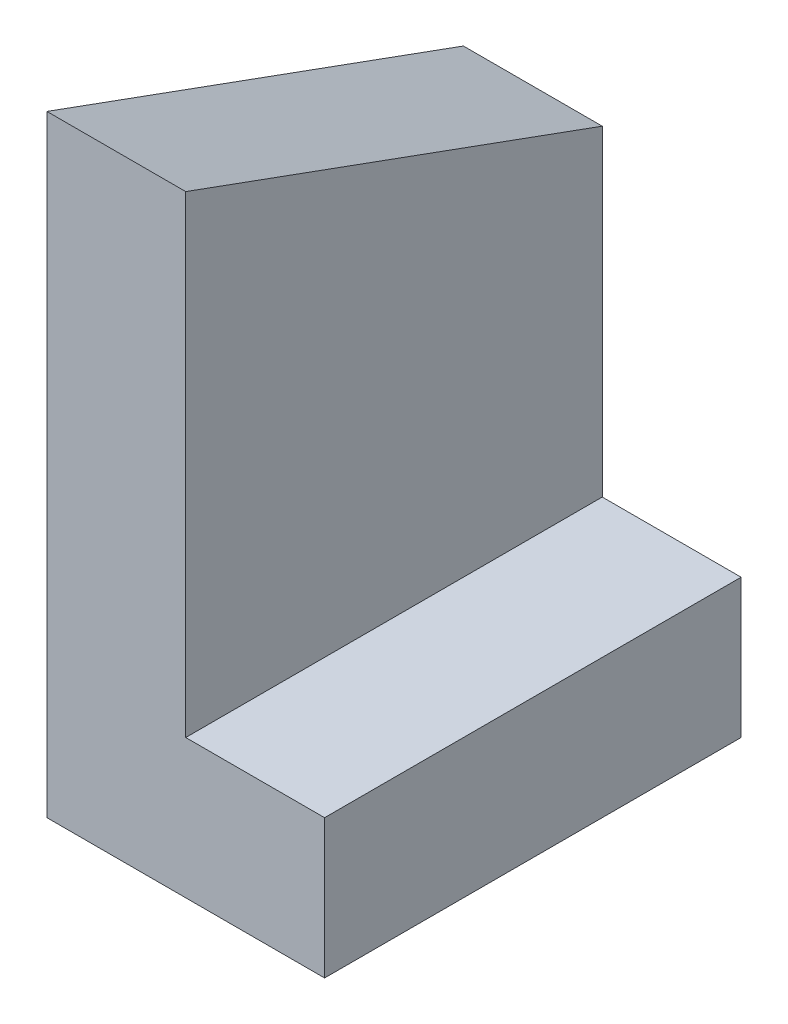
ISO-10303-21;
HEADER;
FILE_DESCRIPTION(('STEP AP214'),'2;1');
FILE_NAME('part.step','',(''),(''),'','','');
FILE_SCHEMA(('AUTOMOTIVE_DESIGN { 1 0 10303 214 1 1 1 1 }'));
ENDSEC;
DATA;
#1=APPLICATION_CONTEXT('core data for automotive mechanical design processes');
#2=APPLICATION_PROTOCOL_DEFINITION('international standard','automotive_design',2000,#1);
#3=PRODUCT_CONTEXT('',#1,'mechanical');
#4=PRODUCT('Part','Part','',(#3));
#5=PRODUCT_RELATED_PRODUCT_CATEGORY('part','',(#4));
#6=PRODUCT_DEFINITION_FORMATION('','',#4);
#7=PRODUCT_DEFINITION_CONTEXT('part definition',#1,'design');
#8=PRODUCT_DEFINITION('design','',#6,#7);
#9=PRODUCT_DEFINITION_SHAPE('','',#8);
#10=(LENGTH_UNIT() NAMED_UNIT(*) SI_UNIT(.MILLI.,.METRE.));
#11=(NAMED_UNIT(*) PLANE_ANGLE_UNIT() SI_UNIT($,.RADIAN.));
#12=(NAMED_UNIT(*) SI_UNIT($,.STERADIAN.) SOLID_ANGLE_UNIT());
#13=UNCERTAINTY_MEASURE_WITH_UNIT(LENGTH_MEASURE(1.E-05),#10,'distance_accuracy_value','');
#14=(GEOMETRIC_REPRESENTATION_CONTEXT(3) GLOBAL_UNCERTAINTY_ASSIGNED_CONTEXT((#13)) GLOBAL_UNIT_ASSIGNED_CONTEXT((#10,
#11,#12)) REPRESENTATION_CONTEXT('',''));
#15=CARTESIAN_POINT('',(0.,0.,0.));
#16=DIRECTION('',(0.,0.,1.));
#17=DIRECTION('',(1.,0.,0.));
#18=AXIS2_PLACEMENT_3D('',#15,#16,#17);
#19=CARTESIAN_POINT('',(0.,0.,15.));
#20=DIRECTION('',(0.,1.,0.));
#21=DIRECTION('',(0.,0.,1.));
#22=AXIS2_PLACEMENT_3D('',#19,#20,#21);
#23=PLANE('',#22);
#24=DIRECTION('',(1.,0.,0.));
#25=VECTOR('',#24,1.);
#26=CARTESIAN_POINT('',(0.,0.,0.));
#27=LINE('',#26,#25);
#28=CARTESIAN_POINT('',(0.,0.,0.));
#29=VERTEX_POINT('',#28);
#30=CARTESIAN_POINT('',(10.,0.,0.));
#31=VERTEX_POINT('',#30);
#32=EDGE_CURVE('E116',#29,#31,#27,.T.);
#33=ORIENTED_EDGE('',*,*,#32,.T.);
#34=DIRECTION('',(0.,0.,-1.));
#35=VECTOR('',#34,1.);
#36=CARTESIAN_POINT('',(10.,0.,15.));
#37=LINE('',#36,#35);
#38=CARTESIAN_POINT('',(10.,0.,15.));
#39=VERTEX_POINT('',#38);
#40=EDGE_CURVE('E40',#39,#31,#37,.T.);
#41=ORIENTED_EDGE('',*,*,#40,.F.);
#42=DIRECTION('',(1.,0.,0.));
#43=VECTOR('',#42,1.);
#44=CARTESIAN_POINT('',(0.,0.,15.));
#45=LINE('',#44,#43);
#46=CARTESIAN_POINT('',(0.,0.,15.));
#47=VERTEX_POINT('',#46);
#48=EDGE_CURVE('E125',#47,#39,#45,.T.);
#49=ORIENTED_EDGE('',*,*,#48,.F.);
#50=DIRECTION('',(0.,0.,-1.));
#51=VECTOR('',#50,1.);
#52=CARTESIAN_POINT('',(0.,0.,15.));
#53=LINE('',#52,#51);
#54=EDGE_CURVE('E111',#47,#29,#53,.T.);
#55=ORIENTED_EDGE('',*,*,#54,.T.);
#56=EDGE_LOOP('',(#33,#41,#49,#55));
#57=FACE_BOUND('',#56,.T.);
#58=ADVANCED_FACE('F33',(#57),#23,.F.);
#59=CARTESIAN_POINT('',(10.,5.,15.));
#60=DIRECTION('',(-1.,0.,0.));
#61=DIRECTION('',(0.,0.,1.));
#62=AXIS2_PLACEMENT_3D('',#59,#60,#61);
#63=PLANE('',#62);
#64=DIRECTION('',(0.,1.,0.));
#65=VECTOR('',#64,1.);
#66=CARTESIAN_POINT('',(10.,5.,0.));
#67=LINE('',#66,#65);
#68=CARTESIAN_POINT('',(10.,5.,0.));
#69=VERTEX_POINT('',#68);
#70=EDGE_CURVE('E119',#31,#69,#67,.T.);
#71=ORIENTED_EDGE('',*,*,#70,.T.);
#72=DIRECTION('',(0.,0.,-1.));
#73=VECTOR('',#72,1.);
#74=CARTESIAN_POINT('',(10.,5.,15.));
#75=LINE('',#74,#73);
#76=CARTESIAN_POINT('',(10.,5.,15.));
#77=VERTEX_POINT('',#76);
#78=EDGE_CURVE('E129',#77,#69,#75,.T.);
#79=ORIENTED_EDGE('',*,*,#78,.F.);
#80=DIRECTION('',(0.,1.,0.));
#81=VECTOR('',#80,1.);
#82=CARTESIAN_POINT('',(10.,5.,15.));
#83=LINE('',#82,#81);
#84=EDGE_CURVE('E85',#39,#77,#83,.T.);
#85=ORIENTED_EDGE('',*,*,#84,.F.);
#86=ORIENTED_EDGE('',*,*,#40,.T.);
#87=EDGE_LOOP('',(#71,#79,#85,#86));
#88=FACE_BOUND('',#87,.T.);
#89=ADVANCED_FACE('F132',(#88),#63,.F.);
#90=CARTESIAN_POINT('',(5.,5.,15.));
#91=DIRECTION('',(0.,-1.,0.));
#92=DIRECTION('',(0.,0.,-1.));
#93=AXIS2_PLACEMENT_3D('',#90,#91,#92);
#94=PLANE('',#93);
#95=DIRECTION('',(-1.,0.,0.));
#96=VECTOR('',#95,1.);
#97=CARTESIAN_POINT('',(5.,5.,0.));
#98=LINE('',#97,#96);
#99=CARTESIAN_POINT('',(5.,5.,0.));
#100=VERTEX_POINT('',#99);
#101=EDGE_CURVE('E121',#69,#100,#98,.T.);
#102=ORIENTED_EDGE('',*,*,#101,.T.);
#103=DIRECTION('',(0.,0.,-1.));
#104=VECTOR('',#103,1.);
#105=CARTESIAN_POINT('',(5.,5.,15.));
#106=LINE('',#105,#104);
#107=CARTESIAN_POINT('',(5.,5.,15.));
#108=VERTEX_POINT('',#107);
#109=EDGE_CURVE('E127',#108,#100,#106,.T.);
#110=ORIENTED_EDGE('',*,*,#109,.F.);
#111=DIRECTION('',(-1.,0.,0.));
#112=VECTOR('',#111,1.);
#113=CARTESIAN_POINT('',(5.,5.,15.));
#114=LINE('',#113,#112);
#115=EDGE_CURVE('E108',#77,#108,#114,.T.);
#116=ORIENTED_EDGE('',*,*,#115,.F.);
#117=ORIENTED_EDGE('',*,*,#78,.T.);
#118=EDGE_LOOP('',(#102,#110,#116,#117));
#119=FACE_BOUND('',#118,.T.);
#120=ADVANCED_FACE('F140',(#119),#94,.F.);
#121=CARTESIAN_POINT('',(5.,5.,15.));
#122=DIRECTION('',(-1.,0.,0.));
#123=DIRECTION('',(0.,0.,1.));
#124=AXIS2_PLACEMENT_3D('',#121,#122,#123);
#125=PLANE('',#124);
#126=DIRECTION('',(0.,1.,0.));
#127=VECTOR('',#126,1.);
#128=CARTESIAN_POINT('',(5.,5.,0.));
#129=LINE('',#128,#127);
#130=CARTESIAN_POINT('',(5.,16.5667635038584,0.));
#131=VERTEX_POINT('',#130);
#132=EDGE_CURVE('E104',#100,#131,#129,.T.);
#133=ORIENTED_EDGE('',*,*,#132,.T.);
#134=DIRECTION('',(0.,-0.342020143325662,-0.939692620785911));
#135=VECTOR('',#134,1.);
#136=CARTESIAN_POINT('',(5.,16.5667635038584,0.));
#137=LINE('',#136,#135);
#138=CARTESIAN_POINT('',(5.,22.0263170178513,15.));
#139=VERTEX_POINT('',#138);
#140=EDGE_CURVE('E46',#139,#131,#137,.T.);
#141=ORIENTED_EDGE('',*,*,#140,.F.);
#142=DIRECTION('',(0.,1.,0.));
#143=VECTOR('',#142,1.);
#144=CARTESIAN_POINT('',(5.,5.,15.));
#145=LINE('',#144,#143);
#146=EDGE_CURVE('E102',#108,#139,#145,.T.);
#147=ORIENTED_EDGE('',*,*,#146,.F.);
#148=ORIENTED_EDGE('',*,*,#109,.T.);
#149=EDGE_LOOP('',(#133,#141,#147,#148));
#150=FACE_BOUND('',#149,.T.);
#151=ADVANCED_FACE('F100',(#150),#125,.F.);
#152=CARTESIAN_POINT('',(0.,0.,15.));
#153=DIRECTION('',(1.,0.,0.));
#154=DIRECTION('',(0.,0.,-1.));
#155=AXIS2_PLACEMENT_3D('',#152,#153,#154);
#156=PLANE('',#155);
#157=DIRECTION('',(0.,-1.,0.));
#158=VECTOR('',#157,1.);
#159=CARTESIAN_POINT('',(0.,0.,15.));
#160=LINE('',#159,#158);
#161=CARTESIAN_POINT('',(0.,22.0263170178513,15.));
#162=VERTEX_POINT('',#161);
#163=EDGE_CURVE('E55',#162,#47,#160,.T.);
#164=ORIENTED_EDGE('',*,*,#163,.F.);
#165=DIRECTION('',(0.,-0.342020143325662,-0.939692620785911));
#166=VECTOR('',#165,1.);
#167=CARTESIAN_POINT('',(0.,19.4497273858767,7.92087816694883));
#168=LINE('',#167,#166);
#169=CARTESIAN_POINT('',(0.,16.5667635038584,0.));
#170=VERTEX_POINT('',#169);
#171=EDGE_CURVE('E94',#162,#170,#168,.T.);
#172=ORIENTED_EDGE('',*,*,#171,.T.);
#173=DIRECTION('',(0.,-1.,0.));
#174=VECTOR('',#173,1.);
#175=CARTESIAN_POINT('',(0.,0.,0.));
#176=LINE('',#175,#174);
#177=EDGE_CURVE('E77',#170,#29,#176,.T.);
#178=ORIENTED_EDGE('',*,*,#177,.T.);
#179=ORIENTED_EDGE('',*,*,#54,.F.);
#180=EDGE_LOOP('',(#164,#172,#178,#179));
#181=FACE_BOUND('',#180,.T.);
#182=ADVANCED_FACE('F147',(#181),#156,.F.);
#183=CARTESIAN_POINT('',(0.,0.,15.));
#184=DIRECTION('',(0.,0.,-1.));
#185=DIRECTION('',(-1.,0.,0.));
#186=AXIS2_PLACEMENT_3D('',#183,#184,#185);
#187=PLANE('',#186);
#188=ORIENTED_EDGE('',*,*,#146,.T.);
#189=DIRECTION('',(1.,0.,0.));
#190=VECTOR('',#189,1.);
#191=CARTESIAN_POINT('',(-5.,22.0263170178513,15.));
#192=LINE('',#191,#190);
#193=EDGE_CURVE('E92',#162,#139,#192,.T.);
#194=ORIENTED_EDGE('',*,*,#193,.F.);
#195=ORIENTED_EDGE('',*,*,#163,.T.);
#196=ORIENTED_EDGE('',*,*,#48,.T.);
#197=ORIENTED_EDGE('',*,*,#84,.T.);
#198=ORIENTED_EDGE('',*,*,#115,.T.);
#199=EDGE_LOOP('',(#188,#194,#195,#196,#197,#198));
#200=FACE_BOUND('',#199,.T.);
#201=ADVANCED_FACE('F106',(#200),#187,.F.);
#202=CARTESIAN_POINT('',(0.,0.,0.));
#203=DIRECTION('',(0.,0.,-1.));
#204=DIRECTION('',(-1.,0.,0.));
#205=AXIS2_PLACEMENT_3D('',#202,#203,#204);
#206=PLANE('',#205);
#207=DIRECTION('',(-1.,0.,0.));
#208=VECTOR('',#207,1.);
#209=CARTESIAN_POINT('',(0.,16.5667635038584,0.));
#210=LINE('',#209,#208);
#211=EDGE_CURVE('E11',#131,#170,#210,.T.);
#212=ORIENTED_EDGE('',*,*,#211,.F.);
#213=ORIENTED_EDGE('',*,*,#132,.F.);
#214=ORIENTED_EDGE('',*,*,#101,.F.);
#215=ORIENTED_EDGE('',*,*,#70,.F.);
#216=ORIENTED_EDGE('',*,*,#32,.F.);
#217=ORIENTED_EDGE('',*,*,#177,.F.);
#218=EDGE_LOOP('',(#212,#213,#214,#215,#216,#217));
#219=FACE_BOUND('',#218,.T.);
#220=ADVANCED_FACE('F137',(#219),#206,.T.);
#221=CARTESIAN_POINT('',(-5.,16.5667635038584,0.));
#222=DIRECTION('',(0.,-0.939692620785911,0.342020143325662));
#223=DIRECTION('',(0.,-0.342020143325662,-0.939692620785911));
#224=AXIS2_PLACEMENT_3D('',#221,#222,#223);
#225=PLANE('',#224);
#226=ORIENTED_EDGE('',*,*,#193,.T.);
#227=ORIENTED_EDGE('',*,*,#140,.T.);
#228=ORIENTED_EDGE('',*,*,#211,.T.);
#229=ORIENTED_EDGE('',*,*,#171,.F.);
#230=EDGE_LOOP('',(#226,#227,#228,#229));
#231=FACE_BOUND('',#230,.T.);
#232=ADVANCED_FACE('F93',(#231),#225,.F.);
#233=CLOSED_SHELL('',(#58,#89,#120,#151,#182,#201,#220,#232));
#234=MANIFOLD_SOLID_BREP('B2',#233);
#235=ADVANCED_BREP_SHAPE_REPRESENTATION('',(#18,#234),#14);
#236=SHAPE_DEFINITION_REPRESENTATION(#9,#235);
ENDSEC;
END-ISO-10303-21;
